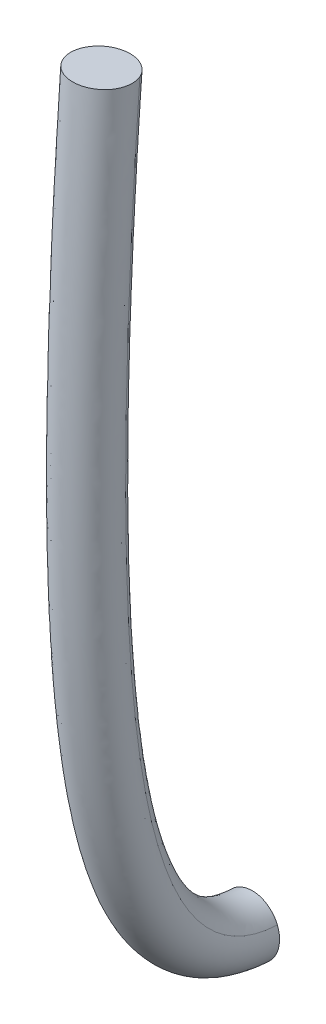
ISO-10303-21;
HEADER;
FILE_DESCRIPTION(('STEP AP214'),'2;1');
FILE_NAME('part.step','',(''),(''),'','','');
FILE_SCHEMA(('AUTOMOTIVE_DESIGN { 1 0 10303 214 1 1 1 1 }'));
ENDSEC;
DATA;
#1=APPLICATION_CONTEXT('core data for automotive mechanical design processes');
#2=APPLICATION_PROTOCOL_DEFINITION('international standard','automotive_design',2000,#1);
#3=PRODUCT_CONTEXT('',#1,'mechanical');
#4=PRODUCT('Part','Part','',(#3));
#5=PRODUCT_RELATED_PRODUCT_CATEGORY('part','',(#4));
#6=PRODUCT_DEFINITION_FORMATION('','',#4);
#7=PRODUCT_DEFINITION_CONTEXT('part definition',#1,'design');
#8=PRODUCT_DEFINITION('design','',#6,#7);
#9=PRODUCT_DEFINITION_SHAPE('','',#8);
#10=(LENGTH_UNIT() NAMED_UNIT(*) SI_UNIT(.MILLI.,.METRE.));
#11=(NAMED_UNIT(*) PLANE_ANGLE_UNIT() SI_UNIT($,.RADIAN.));
#12=(NAMED_UNIT(*) SI_UNIT($,.STERADIAN.) SOLID_ANGLE_UNIT());
#13=UNCERTAINTY_MEASURE_WITH_UNIT(LENGTH_MEASURE(1.E-05),#10,'distance_accuracy_value','');
#14=(GEOMETRIC_REPRESENTATION_CONTEXT(3) GLOBAL_UNCERTAINTY_ASSIGNED_CONTEXT((#13)) GLOBAL_UNIT_ASSIGNED_CONTEXT((#10,
#11,#12)) REPRESENTATION_CONTEXT('',''));
#15=CARTESIAN_POINT('',(0.,0.,0.));
#16=DIRECTION('',(0.,0.,1.));
#17=DIRECTION('',(1.,0.,0.));
#18=AXIS2_PLACEMENT_3D('',#15,#16,#17);
#19=CARTESIAN_POINT('',(20.105,-7.38568943191456,13.8327099550486));
#20=CARTESIAN_POINT('',(20.1050000000002,-7.37642950308165,14.0005635497388));
#21=CARTESIAN_POINT('',(20.1050000000004,-7.27631033306821,14.3051975251042));
#22=CARTESIAN_POINT('',(20.1050000000003,-6.87049685474195,14.6648021718892));
#23=CARTESIAN_POINT('',(20.1049999999999,-6.18722610168326,14.9187504224462));
#24=CARTESIAN_POINT('',(20.1049999999994,-5.06639356937448,15.091763996049));
#25=CARTESIAN_POINT('',(20.1049999999991,-3.38099895027956,15.1354808707394));
#26=CARTESIAN_POINT('',(20.1049999999995,-1.8352738152195,15.0610044224056));
#27=CARTESIAN_POINT('',(20.105,-1.00000001490137,14.9999998509838));
#28=CARTESIAN_POINT('',(20.104999999999,-7.43610265920569,13.8354910864138));
#29=CARTESIAN_POINT('',(20.1049999999992,-7.42638032085317,14.0117267217746));
#30=CARTESIAN_POINT('',(20.1049999999994,-7.31962395430196,14.3361356054714));
#31=CARTESIAN_POINT('',(20.1049999999992,-6.89389462313596,14.7108084227684));
#32=CARTESIAN_POINT('',(20.1049999999989,-6.19822108626262,14.9682947515146));
#33=CARTESIAN_POINT('',(20.1049999999984,-5.06946917324125,15.1423663202107));
#34=CARTESIAN_POINT('',(20.1049999999981,-3.37990338319887,15.1859812523028));
#35=CARTESIAN_POINT('',(20.1049999999985,-1.83238214013709,15.1114175914059));
#36=CARTESIAN_POINT('',(20.104999999999,-0.996322261093751,15.0503556083956));
#37=CARTESIAN_POINT('',(20.1285429167659,-7.50309768941573,13.8391869811192));
#38=CARTESIAN_POINT('',(20.1285429167661,-7.49276122776102,14.0265547542876));
#39=CARTESIAN_POINT('',(20.1285429167663,-7.3771792169589,14.3772405462634));
#40=CARTESIAN_POINT('',(20.1285429167662,-6.92499346417592,14.7719303367576));
#41=CARTESIAN_POINT('',(20.1285429167658,-6.21283912616031,15.0341242473049));
#42=CARTESIAN_POINT('',(20.1285429167653,-5.07356209278338,15.2096054512557));
#43=CARTESIAN_POINT('',(20.128542916765,-3.37845274931476,15.2530880219582));
#44=CARTESIAN_POINT('',(20.1285429167654,-1.82853869442276,15.1784124968612));
#45=CARTESIAN_POINT('',(20.1285429167659,-0.991434828951733,15.1172742658655));
#46=CARTESIAN_POINT('',(20.2005206924959,-7.57470828441944,13.8431375013009));
#47=CARTESIAN_POINT('',(20.2005206924961,-7.56371607666898,14.0423919035529));
#48=CARTESIAN_POINT('',(20.2005206924963,-7.43869072983025,14.4211607506296));
#49=CARTESIAN_POINT('',(20.2005206924962,-6.95824408608038,14.8372332516286));
#50=CARTESIAN_POINT('',(20.2005206924958,-6.22847618068714,15.1044694659981));
#51=CARTESIAN_POINT('',(20.2005206924953,-5.07794725801372,15.2814639955795));
#52=CARTESIAN_POINT('',(20.200520692495,-3.3769117026912,15.3248106963673));
#53=CARTESIAN_POINT('',(20.2005206924954,-1.82442929046619,15.2500228732563));
#54=CARTESIAN_POINT('',(20.2005206924959,-0.986210681389875,15.188803226495));
#55=CARTESIAN_POINT('',(20.2938363978425,-7.61993782253815,13.8456326656427));
#56=CARTESIAN_POINT('',(20.2938363978426,-7.60853053821712,14.0524111100017));
#57=CARTESIAN_POINT('',(20.2938363978429,-7.47755346500366,14.4489228315198));
#58=CARTESIAN_POINT('',(20.2938363978427,-6.97923312112185,14.87851827992));
#59=CARTESIAN_POINT('',(20.2938363978423,-6.23833690594133,15.148925535404));
#60=CARTESIAN_POINT('',(20.2938363978419,-5.08070341865234,15.3268672253803));
#61=CARTESIAN_POINT('',(20.2938363978416,-3.37592581929248,15.3701207186041));
#62=CARTESIAN_POINT('',(20.293836397842,-1.82183531247781,15.295252385628));
#63=CARTESIAN_POINT('',(20.2938363978425,-0.982911088902581,15.2339812040166));
#64=CARTESIAN_POINT('',(20.4350539579306,-7.60399833785108,13.8447533368792));
#65=CARTESIAN_POINT('',(20.4350539579308,-7.59273753658458,14.0488765008679));
#66=CARTESIAN_POINT('',(20.435053957931,-7.4638550528513,14.4391341549577));
#67=CARTESIAN_POINT('',(20.4350539579308,-6.97183906584595,14.8639599714472));
#68=CARTESIAN_POINT('',(20.4350539579304,-6.23486540739448,15.133252808209));
#69=CARTESIAN_POINT('',(20.43505395793,-5.07973517062488,15.3108626653823));
#70=CARTESIAN_POINT('',(20.4350539579297,-3.37627609633214,15.354150677828));
#71=CARTESIAN_POINT('',(20.4350539579301,-1.82274911664781,15.2793128846111));
#72=CARTESIAN_POINT('',(20.4350539579306,-0.98407390873486,15.2180598899628));
#73=CARTESIAN_POINT('',(20.5619042129474,-7.47839422291926,13.8378241724038));
#74=CARTESIAN_POINT('',(20.5619042129475,-7.46828458970755,14.0210802541965));
#75=CARTESIAN_POINT('',(20.5619042129477,-7.35595157762533,14.3620745020885));
#76=CARTESIAN_POINT('',(20.5619042129476,-6.91353131741273,14.7493759654929));
#77=CARTESIAN_POINT('',(20.5619042129472,-6.20745551212693,15.0098397633499));
#78=CARTESIAN_POINT('',(20.5619042129467,-5.07205855645354,15.1848048148518));
#79=CARTESIAN_POINT('',(20.5619042129464,-3.3789929109516,15.2283392899616));
#80=CARTESIAN_POINT('',(20.5619042129469,-1.82995526586642,15.1537090292868));
#81=CARTESIAN_POINT('',(20.5619042129474,-0.993237000184619,15.0925989607329));
#82=CARTESIAN_POINT('',(20.5619946713873,-7.34852983689128,13.8306599828327));
#83=CARTESIAN_POINT('',(20.5619946713875,-7.33961067839402,13.9923364754282));
#84=CARTESIAN_POINT('',(20.5619946713877,-7.24438479587139,14.282394800492));
#85=CARTESIAN_POINT('',(20.5619946713876,-6.85324939019179,14.6308940888043));
#86=CARTESIAN_POINT('',(20.5619946713872,-6.17912045190225,14.8822333349227));
#87=CARTESIAN_POINT('',(20.5619946713867,-5.06412546836236,15.0544663730872));
#88=CARTESIAN_POINT('',(20.5619946713864,-3.38180549715177,15.0982578033206));
#89=CARTESIAN_POINT('',(20.5619946713868,-1.83740539122483,15.0238448792592));
#90=CARTESIAN_POINT('',(20.5619946713873,-1.00271088761162,14.9628826170146));
#91=CARTESIAN_POINT('',(20.5328944907497,-7.28816593306201,13.8273299054843));
#92=CARTESIAN_POINT('',(20.5328944907499,-7.27979996319759,13.978978815553));
#93=CARTESIAN_POINT('',(20.5328944907501,-7.19252826523326,14.2453620116951));
#94=CARTESIAN_POINT('',(20.53289449075,-6.82522668364212,14.5758284858559));
#95=CARTESIAN_POINT('',(20.5328944907496,-6.16594670845852,14.8229238457775));
#96=CARTESIAN_POINT('',(20.5328944907491,-5.06043543370454,14.9938853456995));
#97=CARTESIAN_POINT('',(20.5328944907487,-3.38311047917645,15.0377948178945));
#98=CARTESIAN_POINT('',(20.5328944907492,-1.84086866858586,14.9634811063517));
#99=CARTESIAN_POINT('',(20.5328944907497,-1.007114564763,14.9025875265992));
#100=B_SPLINE_SURFACE_WITH_KNOTS('',3,3,((#19,#20,#21,#22,#23,#24,#25,#26,#27),(#28,#29,#30,#31,
#32,#33,#34,#35,#36),(#37,#38,#39,#40,#41,#42,#43,#44,#45),(#46,#47,#48,#49,#50,#51,#52,#53,
#54),(#55,#56,#57,#58,#59,#60,#61,#62,#63),(#64,#65,#66,#67,#68,#69,#70,#71,#72),(#73,#74,#75,
#76,#77,#78,#79,#80,#81),(#82,#83,#84,#85,#86,#87,#88,#89,#90),(#91,#92,#93,#94,#95,#96,#97,#98,
#99)),.UNSPECIFIED.,.F.,.F.,.F.,(4,1,1,1,1,1,4),(4,1,1,1,1,1,4),(-3.14159265358979,
-2.46839422782055,-2.24399475256414,-1.79519580205131,-1.12199737628207,-0.448798950512828,
0.448798950512828),(0.,0.142857142857143,0.285714285714286,0.428571428571429,0.571428571428571,
0.785714285714286,1.),.UNSPECIFIED.);
#101=CARTESIAN_POINT('',(20.105,-7.38568943191456,13.8327099550486));
#102=CARTESIAN_POINT('',(20.1050000000002,-7.37642950308165,14.0005635497388));
#103=CARTESIAN_POINT('',(20.1050000000004,-7.27631033306821,14.3051975251042));
#104=CARTESIAN_POINT('',(20.1050000000003,-6.87049685474195,14.6648021718892));
#105=CARTESIAN_POINT('',(20.1049999999999,-6.18722610168326,14.9187504224462));
#106=CARTESIAN_POINT('',(20.1049999999994,-5.06639356937448,15.091763996049));
#107=CARTESIAN_POINT('',(20.1049999999991,-3.38099895027956,15.1354808707394));
#108=CARTESIAN_POINT('',(20.1049999999995,-1.8352738152195,15.0610044224056));
#109=CARTESIAN_POINT('',(20.105,-1.00000001490137,14.9999998509838));
#110=B_SPLINE_CURVE_WITH_KNOTS('',3,(#101,#102,#103,#104,#105,#106,#107,#108,#109),
.UNSPECIFIED.,.F.,.F.,(4,1,1,1,1,1,4),(0.,0.142857142857143,0.285714285714286,0.428571428571429,
0.571428571428571,0.785714285714286,1.),.UNSPECIFIED.);
#111=CARTESIAN_POINT('',(20.105,-7.38568943191456,13.8327099550486));
#112=VERTEX_POINT('',#111);
#113=CARTESIAN_POINT('',(20.105,-1.00000001490137,14.9999998509838));
#114=VERTEX_POINT('',#113);
#115=EDGE_CURVE('E11',#112,#114,#110,.T.);
#116=CARTESIAN_POINT('',(20.105,-7.38568943191456,13.8327099550486));
#117=CARTESIAN_POINT('',(20.1049788515072,-7.41102349496364,13.8341075516942));
#118=CARTESIAN_POINT('',(20.1094747813151,-7.43643008051019,13.8355091491665));
#119=CARTESIAN_POINT('',(20.1264206382639,-7.48437080557905,13.8381538807444));
#120=CARTESIAN_POINT('',(20.1388652525249,-7.50690685170369,13.8393971200308));
#121=CARTESIAN_POINT('',(20.170681735168,-7.54639560184601,13.8415755840469));
#122=CARTESIAN_POINT('',(20.1900442838486,-7.56335575884752,13.8425112199331));
#123=CARTESIAN_POINT('',(20.2330926929672,-7.58996430438637,13.8439791255713));
#124=CARTESIAN_POINT('',(20.2567483334039,-7.59966151469674,13.8445140886593));
#125=CARTESIAN_POINT('',(20.306010720783,-7.61052232832376,13.8451132439019));
#126=CARTESIAN_POINT('',(20.3316223185659,-7.61166397028181,13.8451762245208));
#127=CARTESIAN_POINT('',(20.3818906460816,-7.60564172771316,13.8448439972741));
#128=CARTESIAN_POINT('',(20.4065456341939,-7.59846336735366,13.8444479908246));
#129=CARTESIAN_POINT('',(20.4520091524381,-7.57620558683224,13.8432201025331));
#130=CARTESIAN_POINT('',(20.4728122807258,-7.56111518270369,13.8423876147419));
#131=CARTESIAN_POINT('',(20.5085093215146,-7.52495375799959,13.8403927082885));
#132=CARTESIAN_POINT('',(20.5233801905173,-7.50385995054713,13.8392290325496));
#133=CARTESIAN_POINT('',(20.5445568692442,-7.45823127903589,13.8367118493359));
#134=CARTESIAN_POINT('',(20.5510311146202,-7.43377533531727,13.8353626956357));
#135=CARTESIAN_POINT('',(20.5547936937795,-7.39652995024634,13.8333079906664));
#136=CARTESIAN_POINT('',(20.5550379632447,-7.38393665230887,13.8326132599821));
#137=CARTESIAN_POINT('',(20.5535028503597,-7.35886211579796,13.8312299805592));
#138=CARTESIAN_POINT('',(20.5517244878784,-7.346380823945,13.8305414288812));
#139=CARTESIAN_POINT('',(20.5460062717397,-7.32136161783503,13.8291612018538));
#140=CARTESIAN_POINT('',(20.5419786175704,-7.30884341887502,13.8284706141323));
#141=CARTESIAN_POINT('',(20.5316667804114,-7.28477416836429,13.8271427930201));
#142=CARTESIAN_POINT('',(20.5253840241965,-7.27322251098037,13.8265055262076));
#143=CARTESIAN_POINT('',(20.5113887531906,-7.25221185447059,13.8253464376318));
#144=CARTESIAN_POINT('',(20.5038109637877,-7.24266221389465,13.8248196154789));
#145=CARTESIAN_POINT('',(20.4872453044877,-7.22485202513436,13.823837086146));
#146=CARTESIAN_POINT('',(20.4782555394019,-7.21659323972969,13.8233814762127));
#147=CARTESIAN_POINT('',(20.458503730994,-7.20109209762107,13.8225263293628));
#148=CARTESIAN_POINT('',(20.4476659976026,-7.19394565176322,13.8221320835309));
#149=CARTESIAN_POINT('',(20.4249564189238,-7.1815705218185,13.8214493884549));
#150=CARTESIAN_POINT('',(20.4130860765126,-7.1763391065007,13.8211607885378));
#151=CARTESIAN_POINT('',(20.3886499654054,-7.16810843603039,13.8207067296126));
#152=CARTESIAN_POINT('',(20.3760879090977,-7.16509831574593,13.8205406712111));
#153=CARTESIAN_POINT('',(20.3506237926517,-7.16139161199649,13.8203361845989));
#154=CARTESIAN_POINT('',(20.3377215235414,-7.16069648550686,13.8202978367648));
#155=CARTESIAN_POINT('',(20.3127061629323,-7.16145018257671,13.8203394157446));
#156=CARTESIAN_POINT('',(20.3005889817305,-7.16278226284182,13.8204129022164));
#157=CARTESIAN_POINT('',(20.2767016294411,-7.16730314148762,13.8206623041705));
#158=CARTESIAN_POINT('',(20.2649316393946,-7.17049289116785,13.8208382721329));
#159=CARTESIAN_POINT('',(20.2411238204534,-7.1789887922779,13.8213069629572));
#160=CARTESIAN_POINT('',(20.2291378904646,-7.18444182778009,13.8216077889286));
#161=CARTESIAN_POINT('',(20.2063330755679,-7.19736485132934,13.8223207094865));
#162=CARTESIAN_POINT('',(20.1955125571539,-7.20483196346424,13.8227326454185));
#163=CARTESIAN_POINT('',(20.1664608088177,-7.2291944565982,13.8240766437584));
#164=CARTESIAN_POINT('',(20.1502457556113,-7.248552957074,13.8251445883386));
#165=CARTESIAN_POINT('',(20.1246459395465,-7.29144832645119,13.8275109842947));
#166=CARTESIAN_POINT('',(20.1153046276089,-7.31501062571154,13.8288108385796));
#167=CARTESIAN_POINT('',(20.1067288320976,-7.35460707440456,13.8309952439694));
#168=CARTESIAN_POINT('',(20.1050129849524,-7.37013458328151,13.8318518453869));
#169=CARTESIAN_POINT('',(20.105,-7.38568943191456,13.8327099550486));
#170=B_SPLINE_CURVE_WITH_KNOTS('',3,(#116,#117,#118,#119,#120,#121,#122,#123,#124,#125,#126,
#127,#128,#129,#130,#131,#132,#133,#134,#135,#136,#137,#138,#139,#140,#141,#142,#143,#144,#145,
#146,#147,#148,#149,#150,#151,#152,#153,#154,#155,#156,#157,#158,#159,#160,#161,#162,#163,#164,
#165,#166,#167,#168,#169),.UNSPECIFIED.,.T.,.F.,(4,2,2,2,2,2,2,2,2,2,2,2,2,2,2,2,2,2,2,2,2,2,2,
2,2,2,4),(0.,0.0759449719461765,0.151839235515468,0.227631639015673,0.302909874479025,
0.378381276290297,0.453984186896779,0.529692332923697,0.605691764006138,0.680141789301073,
0.717865616532018,0.75557043076028,0.794861750307744,0.834128254422809,0.870580820458003,
0.907082738861802,0.945868221118087,0.984598169703671,1.02313739754699,1.06170087604047,
1.09812603630811,1.13456986606824,1.17388362183033,1.21314153573266,1.28747366466479,
1.36227172436107,1.40890113949974),.UNSPECIFIED.);
#171=CARTESIAN_POINT('',(20.5328944907497,-7.28816593306201,13.8273299054844));
#172=VERTEX_POINT('',#171);
#173=EDGE_CURVE('E47',#112,#172,#170,.T.);
#174=CARTESIAN_POINT('',(20.5328944907497,-7.28816593306201,13.8273299054843));
#175=CARTESIAN_POINT('',(20.5328944907499,-7.27979996319759,13.978978815553));
#176=CARTESIAN_POINT('',(20.5328944907501,-7.19252826523326,14.2453620116951));
#177=CARTESIAN_POINT('',(20.53289449075,-6.82522668364212,14.5758284858559));
#178=CARTESIAN_POINT('',(20.5328944907496,-6.16594670845852,14.8229238457775));
#179=CARTESIAN_POINT('',(20.5328944907491,-5.06043543370454,14.9938853456995));
#180=CARTESIAN_POINT('',(20.5328944907487,-3.38311047917645,15.0377948178945));
#181=CARTESIAN_POINT('',(20.5328944907492,-1.84086866858586,14.9634811063517));
#182=CARTESIAN_POINT('',(20.5328944907497,-1.007114564763,14.9025875265992));
#183=B_SPLINE_CURVE_WITH_KNOTS('',3,(#174,#175,#176,#177,#178,#179,#180,#181,#182),
.UNSPECIFIED.,.F.,.F.,(4,1,1,1,1,1,4),(0.,0.142857142857143,0.285714285714286,0.428571428571429,
0.571428571428571,0.785714285714286,1.),.UNSPECIFIED.);
#184=CARTESIAN_POINT('',(20.5328944907497,-1.00711456476301,14.9025875265992));
#185=VERTEX_POINT('',#184);
#186=EDGE_CURVE('E29',#172,#185,#183,.T.);
#187=CARTESIAN_POINT('',(20.105,-1.00000001490137,14.9999998509838));
#188=CARTESIAN_POINT('',(20.1050108772477,-1.00092501757203,14.9873347264199));
#189=CARTESIAN_POINT('',(20.106151119176,-1.00185029323675,14.9746658640249));
#190=CARTESIAN_POINT('',(20.110574720008,-1.00367479887776,14.9496847564628));
#191=CARTESIAN_POINT('',(20.1138631462682,-1.00457396200583,14.9373734265807));
#192=CARTESIAN_POINT('',(20.1223930498606,-1.00631862329882,14.9134855467957));
#193=CARTESIAN_POINT('',(20.1276288341305,-1.00716426956846,14.9019069690449));
#194=CARTESIAN_POINT('',(20.1399102199068,-1.00878193764067,14.879757878791));
#195=CARTESIAN_POINT('',(20.146954554736,-1.00955401045596,14.8691866678223));
#196=CARTESIAN_POINT('',(20.1629611178269,-1.0110247954784,14.8490486983799));
#197=CARTESIAN_POINT('',(20.1719758723716,-1.01172050452738,14.8395230591089));
#198=CARTESIAN_POINT('',(20.1916143935733,-1.01297811875555,14.8223038214156));
#199=CARTESIAN_POINT('',(20.2022370743585,-1.01354011358143,14.814608995552));
#200=CARTESIAN_POINT('',(20.2238921302555,-1.01448303159169,14.8016985743909));
#201=CARTESIAN_POINT('',(20.2348444355511,-1.01487384025598,14.7963476272307));
#202=CARTESIAN_POINT('',(20.2574659747684,-1.01552623634738,14.7874150284128));
#203=CARTESIAN_POINT('',(20.2691361700395,-1.01578764606222,14.7838358099892));
#204=CARTESIAN_POINT('',(20.2936194616283,-1.01618758195494,14.7783598929359));
#205=CARTESIAN_POINT('',(20.3064588230929,-1.01631762469802,14.7765793493851));
#206=CARTESIAN_POINT('',(20.3322429368416,-1.01641952496697,14.7751841322251));
#207=CARTESIAN_POINT('',(20.3451875150075,-1.0163916052657,14.7755664084127));
#208=CARTESIAN_POINT('',(20.3707637347784,-1.01616767301251,14.7786324859179));
#209=CARTESIAN_POINT('',(20.3833962841824,-1.01597222740942,14.7813085245794));
#210=CARTESIAN_POINT('',(20.4079703628309,-1.01541824379158,14.7888936610867));
#211=CARTESIAN_POINT('',(20.419911478652,-1.01505960931487,14.7938040796883));
#212=CARTESIAN_POINT('',(20.442159505524,-1.01422596994201,14.8052182591644));
#213=CARTESIAN_POINT('',(20.4525202798894,-1.01375850145004,14.8116188316906));
#214=CARTESIAN_POINT('',(20.472131022246,-1.0127123637185,14.8259425359365));
#215=CARTESIAN_POINT('',(20.4813803478249,-1.01213363066615,14.8338665413799));
#216=CARTESIAN_POINT('',(20.499224186029,-1.01082761214954,14.8517485299626));
#217=CARTESIAN_POINT('',(20.5077067845239,-1.0100921376645,14.8618186370684));
#218=CARTESIAN_POINT('',(20.5227510667084,-1.00852549023177,14.8832691533888));
#219=CARTESIAN_POINT('',(20.5293155690865,-1.00769446023529,14.8946476053172));
#220=CARTESIAN_POINT('',(20.5450876284981,-1.00517431348706,14.929153421893));
#221=CARTESIAN_POINT('',(20.5513998062166,-1.00338306342649,14.9536791944794));
#222=CARTESIAN_POINT('',(20.5548700858605,-1.00066657339317,14.9908733407667));
#223=CARTESIAN_POINT('',(20.5550156512585,-0.999752449254357,15.0033895166137));
#224=CARTESIAN_POINT('',(20.5533086184327,-0.997933201642155,15.0282986313136));
#225=CARTESIAN_POINT('',(20.5514573191297,-0.997028072703863,15.0406916449919));
#226=CARTESIAN_POINT('',(20.5456044962046,-0.995208976348434,15.065598688686));
#227=CARTESIAN_POINT('',(20.5415036542597,-0.994296684894369,15.0780897714371));
#228=CARTESIAN_POINT('',(20.5310648788534,-0.992542500748221,15.102108038004));
#229=CARTESIAN_POINT('',(20.5247272658834,-0.991700597991991,15.1136353596179));
#230=CARTESIAN_POINT('',(20.5105886051987,-0.990164523738441,15.1346672683655));
#231=CARTESIAN_POINT('',(20.5029102710095,-0.98946429324643,15.1442548151758));
#232=CARTESIAN_POINT('',(20.4861171758807,-0.988161825764072,15.1620881830435));
#233=CARTESIAN_POINT('',(20.4770018550045,-0.987559627159559,15.1703334785224));
#234=CARTESIAN_POINT('',(20.4571428367764,-0.986445082920254,15.1855938037846));
#235=CARTESIAN_POINT('',(20.4463457268493,-0.985937755976307,15.192540117718));
#236=CARTESIAN_POINT('',(20.4237059812979,-0.985067958749019,15.2044493700675));
#237=CARTESIAN_POINT('',(20.4118637334565,-0.98470543501218,15.2094130403681));
#238=CARTESIAN_POINT('',(20.3877576891435,-0.98413814421888,15.2171803785487));
#239=CARTESIAN_POINT('',(20.3755072851708,-0.98393033123476,15.2200257512306));
#240=CARTESIAN_POINT('',(20.3507030739745,-0.983662422732523,15.2236939509667));
#241=CARTESIAN_POINT('',(20.3381491661731,-0.983602376879676,15.2245160980046));
#242=CARTESIAN_POINT('',(20.3127472473566,-0.983633583948294,15.2240888112259));
#243=CARTESIAN_POINT('',(20.2998999841574,-0.983728771290014,15.2227855073781));
#244=CARTESIAN_POINT('',(20.274639106779,-0.984082558811496,15.2179414532245));
#245=CARTESIAN_POINT('',(20.2622253690031,-0.984341112008194,15.2144013462101));
#246=CARTESIAN_POINT('',(20.2385537896796,-0.984998671354907,15.2053980521672));
#247=CARTESIAN_POINT('',(20.2272724201067,-0.985393222285045,15.1999958659513));
#248=CARTESIAN_POINT('',(20.2057380164102,-0.986310577885366,15.1874354449751));
#249=CARTESIAN_POINT('',(20.1954851762671,-0.986833406684913,15.1802768798357));
#250=CARTESIAN_POINT('',(20.1760544732485,-0.988010400769111,15.1641614921073));
#251=CARTESIAN_POINT('',(20.1669105652243,-0.988667567036029,15.155163580108));
#252=CARTESIAN_POINT('',(20.1503429548446,-0.990086866096214,15.1357305557925));
#253=CARTESIAN_POINT('',(20.1429191630073,-0.990848993426031,15.1252955182818));
#254=CARTESIAN_POINT('',(20.1238041935548,-0.993217746511921,15.0928625817663));
#255=CARTESIAN_POINT('',(20.1147059157642,-0.994942071803088,15.0692531422543));
#256=CARTESIAN_POINT('',(20.1065715835225,-0.997800159289978,15.0301202454699));
#257=CARTESIAN_POINT('',(20.1049870635106,-0.998899894024233,15.0150626917584));
#258=CARTESIAN_POINT('',(20.105,-1.00000001490137,14.9999998509838));
#259=B_SPLINE_CURVE_WITH_KNOTS('',3,(#187,#188,#189,#190,#191,#192,#193,#194,#195,#196,#197,
#198,#199,#200,#201,#202,#203,#204,#205,#206,#207,#208,#209,#210,#211,#212,#213,#214,#215,#216,
#217,#218,#219,#220,#221,#222,#223,#224,#225,#226,#227,#228,#229,#230,#231,#232,#233,#234,#235,
#236,#237,#238,#239,#240,#241,#242,#243,#244,#245,#246,#247,#248,#249,#250,#251,#252,#253,#254,
#255,#256,#257,#258),.UNSPECIFIED.,.T.,.F.,(4,2,2,2,2,2,2,2,2,2,2,2,2,2,2,2,2,2,2,2,2,2,2,2,2,2,
2,2,2,2,2,2,2,2,2,4),(0.,0.0380591143280294,0.0762083321511472,0.114246887094909,
0.152258872833419,0.191445156576274,0.230605093964911,0.267037486158282,0.303519775539045,
0.342230980421254,0.380887604897359,0.419413920060483,0.457963038011012,0.494379306851833,
0.530816523900577,0.570174405433455,0.609474155325225,0.683958323872819,0.721499926086663,
0.759017122954099,0.798342240071284,0.837661724849967,0.874411466626916,0.911175563874474,
0.949531287917599,0.987872839991294,1.02543797234723,1.06301572880836,1.1015607869981,
1.14009476489694,1.17747051652597,1.21485330401747,1.25318645062784,1.29151760266811,
1.36605577922807,1.41132010933814),.UNSPECIFIED.);
#260=EDGE_CURVE('E48',#185,#114,#259,.T.);
#261=ORIENTED_EDGE('',*,*,#115,.F.);
#262=ORIENTED_EDGE('',*,*,#173,.T.);
#263=ORIENTED_EDGE('',*,*,#186,.T.);
#264=ORIENTED_EDGE('',*,*,#260,.T.);
#265=EDGE_LOOP('',(#261,#262,#263,#264));
#266=FACE_BOUND('',#265,.T.);
#267=ADVANCED_FACE('F17',(#266),#100,.T.);
#268=CARTESIAN_POINT('',(20.33,-7.38568943191911,13.8327099550486));
#269=DIRECTION('',(1.1126142427123E-12,0.0550829445172842,0.998481782118886));
#270=DIRECTION('',(0.,-0.998481782118886,0.0550829445172842));
#271=AXIS2_PLACEMENT_3D('',#268,#269,#270);
#272=PLANE('',#271);
#273=ORIENTED_EDGE('',*,*,#173,.F.);
#274=EDGE_CURVE('E50',#172,#112,#170,.T.);
#275=ORIENTED_EDGE('',*,*,#274,.F.);
#276=EDGE_LOOP('',(#273,#275));
#277=FACE_BOUND('',#276,.T.);
#278=ADVANCED_FACE('F54',(#277),#272,.F.);
#279=CARTESIAN_POINT('',(20.33,-1.00000001490116,14.9999998509884));
#280=DIRECTION('',(5.32614965869058E-13,0.997343536648528,-0.0728414024124084));
#281=DIRECTION('',(0.,0.0728414024124084,0.997343536648528));
#282=AXIS2_PLACEMENT_3D('',#279,#280,#281);
#283=PLANE('',#282);
#284=EDGE_CURVE('E56',#114,#185,#259,.T.);
#285=ORIENTED_EDGE('',*,*,#284,.F.);
#286=ORIENTED_EDGE('',*,*,#260,.F.);
#287=EDGE_LOOP('',(#285,#286));
#288=FACE_BOUND('',#287,.T.);
#289=ADVANCED_FACE('F84',(#288),#283,.T.);
#290=CARTESIAN_POINT('',(20.5328944907497,-7.28816593306201,13.8273299054843));
#291=CARTESIAN_POINT('',(20.5328944907499,-7.27979996319759,13.978978815553));
#292=CARTESIAN_POINT('',(20.5328944907501,-7.19252826523326,14.2453620116951));
#293=CARTESIAN_POINT('',(20.53289449075,-6.82522668364212,14.5758284858559));
#294=CARTESIAN_POINT('',(20.5328944907496,-6.16594670845852,14.8229238457775));
#295=CARTESIAN_POINT('',(20.5328944907491,-5.06043543370454,14.9938853456995));
#296=CARTESIAN_POINT('',(20.5328944907487,-3.38311047917645,15.0377948178945));
#297=CARTESIAN_POINT('',(20.5328944907492,-1.84086866858586,14.9634811063517));
#298=CARTESIAN_POINT('',(20.5328944907497,-1.007114564763,14.9025875265992));
#299=CARTESIAN_POINT('',(20.503794310112,-7.22780202923275,13.8239998281359));
#300=CARTESIAN_POINT('',(20.5037943101122,-7.21998924800116,13.9656211556778));
#301=CARTESIAN_POINT('',(20.5037943101124,-7.14067173459514,14.2083292228983));
#302=CARTESIAN_POINT('',(20.5037943101123,-6.79720397709245,14.5207628829074));
#303=CARTESIAN_POINT('',(20.5037943101119,-6.15277296501478,14.7636143566323));
#304=CARTESIAN_POINT('',(20.5037943101114,-5.05674539904671,14.9333043183118));
#305=CARTESIAN_POINT('',(20.5037943101111,-3.38441546120114,14.9773318324683));
#306=CARTESIAN_POINT('',(20.5037943101115,-1.84433194594689,14.9031173334442));
#307=CARTESIAN_POINT('',(20.503794310112,-1.01151824191439,14.8422924361838));
#308=CARTESIAN_POINT('',(20.3872902064873,-7.13476285509053,13.8188671639663));
#309=CARTESIAN_POINT('',(20.3872902064875,-7.12780228585946,13.9450405490553));
#310=CARTESIAN_POINT('',(20.3872902064877,-7.06075050547569,14.151260583821));
#311=CARTESIAN_POINT('',(20.3872902064876,-6.75400678200343,14.4359083301865));
#312=CARTESIAN_POINT('',(20.3872902064872,-6.13246091721091,14.6722123182538));
#313=CARTESIAN_POINT('',(20.3872902064867,-5.05105164680533,14.8399384279204));
#314=CARTESIAN_POINT('',(20.3872902064864,-3.38642100507111,14.884144446925));
#315=CARTESIAN_POINT('',(20.3872902064868,-1.84967062640998,14.8100784132744));
#316=CARTESIAN_POINT('',(20.3872902064873,-1.01830565060338,14.749359324486));
#317=CARTESIAN_POINT('',(20.1693992515203,-7.18477550674008,13.8216261968956));
#318=CARTESIAN_POINT('',(20.1693992515204,-7.17735759657848,13.9560897449617));
#319=CARTESIAN_POINT('',(20.1693992515207,-7.10370174986293,14.1819190760427));
#320=CARTESIAN_POINT('',(20.1693992515205,-6.7772374238002,14.4814882277558));
#321=CARTESIAN_POINT('',(20.1693992515201,-6.14339273574721,14.7213232927024));
#322=CARTESIAN_POINT('',(20.1693992515196,-5.05412366073989,14.8901123409489));
#323=CARTESIAN_POINT('',(20.1693992515194,-3.38535348875395,14.9342286193548));
#324=CARTESIAN_POINT('',(20.1693992515198,-1.84679955777553,14.8600908339767));
#325=CARTESIAN_POINT('',(20.1693992515203,-1.01465711965381,14.7993149629028));
#326=CARTESIAN_POINT('',(20.1050000000014,-7.31847179552639,13.829001779895));
#327=CARTESIAN_POINT('',(20.1050000000015,-7.30982729388697,13.9856996012998));
#328=CARTESIAN_POINT('',(20.1050000000018,-7.21857345268289,14.2639738395393));
#329=CARTESIAN_POINT('',(20.1050000000016,-6.83928475436006,14.6035092858988));
#330=CARTESIAN_POINT('',(20.1050000000012,-6.17254670542112,14.8527231588054));
#331=CARTESIAN_POINT('',(20.1050000000007,-5.0622760354833,15.0243153601034));
#332=CARTESIAN_POINT('',(20.1050000000005,-3.38244418348287,15.0681590173172));
#333=CARTESIAN_POINT('',(20.1050000000009,-1.8391312839693,14.99378700265));
#334=CARTESIAN_POINT('',(20.1050000000014,-1.00490368664485,14.9328588411016));
#335=CARTESIAN_POINT('',(20.105,-7.38568943191456,13.8327099550486));
#336=CARTESIAN_POINT('',(20.1050000000002,-7.37642950308165,14.0005635497388));
#337=CARTESIAN_POINT('',(20.1050000000004,-7.27631033306821,14.3051975251042));
#338=CARTESIAN_POINT('',(20.1050000000003,-6.87049685474195,14.6648021718892));
#339=CARTESIAN_POINT('',(20.1049999999999,-6.18722610168326,14.9187504224462));
#340=CARTESIAN_POINT('',(20.1049999999994,-5.06639356937448,15.091763996049));
#341=CARTESIAN_POINT('',(20.1049999999991,-3.38099895027956,15.1354808707394));
#342=CARTESIAN_POINT('',(20.1049999999995,-1.8352738152195,15.0610044224056));
#343=CARTESIAN_POINT('',(20.105,-1.00000001490137,14.9999998509838));
#344=B_SPLINE_SURFACE_WITH_KNOTS('',3,3,((#290,#291,#292,#293,#294,#295,#296,#297,#298),(#299,
#300,#301,#302,#303,#304,#305,#306,#307),(#308,#309,#310,#311,#312,#313,#314,#315,#316),(#317,
#318,#319,#320,#321,#322,#323,#324,#325),(#326,#327,#328,#329,#330,#331,#332,#333,#334),(#335,
#336,#337,#338,#339,#340,#341,#342,#343)),.UNSPECIFIED.,.F.,.F.,.F.,(4,1,1,4),(4,1,1,1,1,1,4),
(0.448798950512828,1.34639685153848,2.24399475256414,3.14159265358979),(0.,0.142857142857143,
0.285714285714286,0.428571428571429,0.571428571428571,0.785714285714286,1.),.UNSPECIFIED.);
#345=ORIENTED_EDGE('',*,*,#274,.T.);
#346=ORIENTED_EDGE('',*,*,#115,.T.);
#347=ORIENTED_EDGE('',*,*,#284,.T.);
#348=ORIENTED_EDGE('',*,*,#186,.F.);
#349=EDGE_LOOP('',(#345,#346,#347,#348));
#350=FACE_BOUND('',#349,.T.);
#351=ADVANCED_FACE('F51',(#350),#344,.T.);
#352=CLOSED_SHELL('',(#267,#278,#289,#351));
#353=MANIFOLD_SOLID_BREP('B1',#352);
#354=ADVANCED_BREP_SHAPE_REPRESENTATION('',(#18,#353),#14);
#355=SHAPE_DEFINITION_REPRESENTATION(#9,#354);
ENDSEC;
END-ISO-10303-21;
